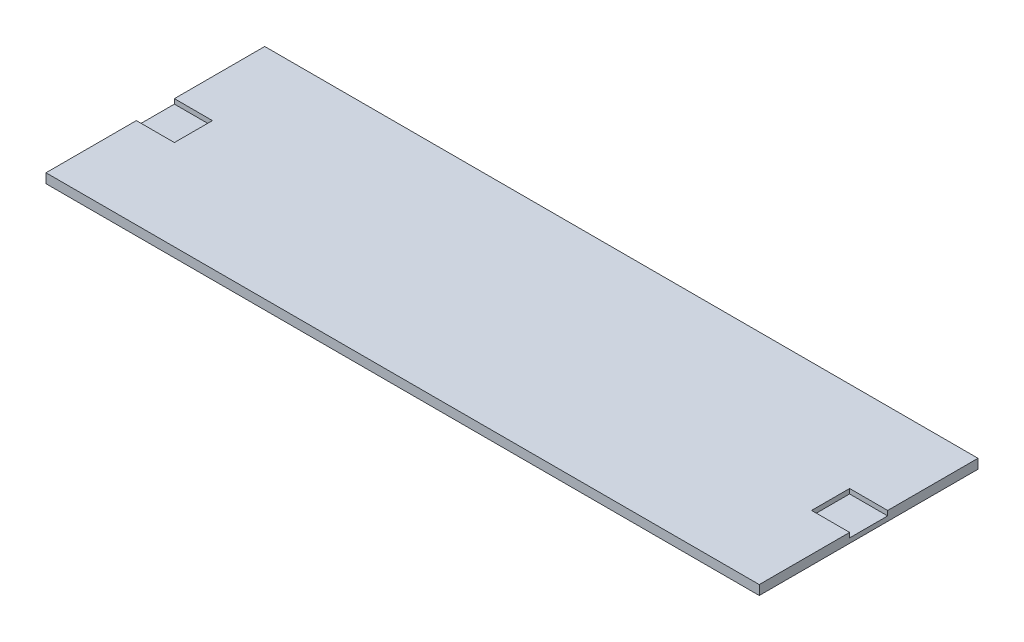
ISO-10303-21;
HEADER;
FILE_DESCRIPTION(('STEP AP214'),'2;1');
FILE_NAME('part.step','',(''),(''),'','','');
FILE_SCHEMA(('AUTOMOTIVE_DESIGN { 1 0 10303 214 1 1 1 1 }'));
ENDSEC;
DATA;
#1=APPLICATION_CONTEXT('core data for automotive mechanical design processes');
#2=APPLICATION_PROTOCOL_DEFINITION('international standard','automotive_design',2000,#1);
#3=PRODUCT_CONTEXT('',#1,'mechanical');
#4=PRODUCT('Part','Part','',(#3));
#5=PRODUCT_RELATED_PRODUCT_CATEGORY('part','',(#4));
#6=PRODUCT_DEFINITION_FORMATION('','',#4);
#7=PRODUCT_DEFINITION_CONTEXT('part definition',#1,'design');
#8=PRODUCT_DEFINITION('design','',#6,#7);
#9=PRODUCT_DEFINITION_SHAPE('','',#8);
#10=(LENGTH_UNIT() NAMED_UNIT(*) SI_UNIT(.MILLI.,.METRE.));
#11=(NAMED_UNIT(*) PLANE_ANGLE_UNIT() SI_UNIT($,.RADIAN.));
#12=(NAMED_UNIT(*) SI_UNIT($,.STERADIAN.) SOLID_ANGLE_UNIT());
#13=UNCERTAINTY_MEASURE_WITH_UNIT(LENGTH_MEASURE(1.E-05),#10,'distance_accuracy_value','');
#14=(GEOMETRIC_REPRESENTATION_CONTEXT(3) GLOBAL_UNCERTAINTY_ASSIGNED_CONTEXT((#13)) GLOBAL_UNIT_ASSIGNED_CONTEXT((#10,
#11,#12)) REPRESENTATION_CONTEXT('',''));
#15=CARTESIAN_POINT('',(0.,0.,0.));
#16=DIRECTION('',(0.,0.,1.));
#17=DIRECTION('',(1.,0.,0.));
#18=AXIS2_PLACEMENT_3D('',#15,#16,#17);
#19=CARTESIAN_POINT('',(-89.1210728294941,6.35,-55.7339246500866));
#20=DIRECTION('',(1.,0.,0.));
#21=DIRECTION('',(0.,0.,-1.));
#22=AXIS2_PLACEMENT_3D('',#19,#20,#21);
#23=PLANE('',#22);
#24=DIRECTION('',(0.,0.,1.));
#25=VECTOR('',#24,1.);
#26=CARTESIAN_POINT('',(-89.1210728294941,3.175,4.59107534991337));
#27=LINE('',#26,#25);
#28=CARTESIAN_POINT('',(-89.1210728294941,3.175,4.59107534991337));
#29=VERTEX_POINT('',#28);
#30=CARTESIAN_POINT('',(-89.1210728294941,3.175,29.9910753499134));
#31=VERTEX_POINT('',#30);
#32=EDGE_CURVE('E150',#29,#31,#27,.T.);
#33=ORIENTED_EDGE('',*,*,#32,.F.);
#34=DIRECTION('',(0.,1.,0.));
#35=VECTOR('',#34,1.);
#36=CARTESIAN_POINT('',(-89.1210728294941,3.175,4.59107534991337));
#37=LINE('',#36,#35);
#38=CARTESIAN_POINT('',(-89.1210728294941,6.35,4.59107534991337));
#39=VERTEX_POINT('',#38);
#40=EDGE_CURVE('E170',#29,#39,#37,.T.);
#41=ORIENTED_EDGE('',*,*,#40,.T.);
#42=DIRECTION('',(0.,0.,1.));
#43=VECTOR('',#42,1.);
#44=CARTESIAN_POINT('',(-89.1210728294941,6.35,-55.7339246500866));
#45=LINE('',#44,#43);
#46=CARTESIAN_POINT('',(-89.1210728294941,6.35,-55.7339246500866));
#47=VERTEX_POINT('',#46);
#48=EDGE_CURVE('E179',#47,#39,#45,.T.);
#49=ORIENTED_EDGE('',*,*,#48,.F.);
#50=DIRECTION('',(0.,-1.,0.));
#51=VECTOR('',#50,1.);
#52=CARTESIAN_POINT('',(-89.1210728294941,6.35,-55.7339246500866));
#53=LINE('',#52,#51);
#54=CARTESIAN_POINT('',(-89.1210728294941,0.,-55.7339246500866));
#55=VERTEX_POINT('',#54);
#56=EDGE_CURVE('E190',#47,#55,#53,.T.);
#57=ORIENTED_EDGE('',*,*,#56,.T.);
#58=DIRECTION('',(0.,0.,1.));
#59=VECTOR('',#58,1.);
#60=CARTESIAN_POINT('',(-89.1210728294941,0.,-55.7339246500866));
#61=LINE('',#60,#59);
#62=CARTESIAN_POINT('',(-89.1210728294941,0.,90.3160753499134));
#63=VERTEX_POINT('',#62);
#64=EDGE_CURVE('E173',#55,#63,#61,.T.);
#65=ORIENTED_EDGE('',*,*,#64,.T.);
#66=DIRECTION('',(0.,-1.,0.));
#67=VECTOR('',#66,1.);
#68=CARTESIAN_POINT('',(-89.1210728294941,6.35,90.3160753499134));
#69=LINE('',#68,#67);
#70=CARTESIAN_POINT('',(-89.1210728294941,6.35,90.3160753499134));
#71=VERTEX_POINT('',#70);
#72=EDGE_CURVE('E11',#71,#63,#69,.T.);
#73=ORIENTED_EDGE('',*,*,#72,.F.);
#74=CARTESIAN_POINT('',(-89.1210728294941,6.35,29.9910753499134));
#75=VERTEX_POINT('',#74);
#76=EDGE_CURVE('E183',#75,#71,#45,.T.);
#77=ORIENTED_EDGE('',*,*,#76,.F.);
#78=DIRECTION('',(0.,1.,0.));
#79=VECTOR('',#78,1.);
#80=CARTESIAN_POINT('',(-89.1210728294941,3.175,29.9910753499134));
#81=LINE('',#80,#79);
#82=EDGE_CURVE('E55',#31,#75,#81,.T.);
#83=ORIENTED_EDGE('',*,*,#82,.F.);
#84=EDGE_LOOP('',(#33,#41,#49,#57,#65,#73,#77,#83));
#85=FACE_BOUND('',#84,.T.);
#86=ADVANCED_FACE('F33',(#85),#23,.F.);
#87=CARTESIAN_POINT('',(-89.1210728294941,6.35,90.3160753499134));
#88=DIRECTION('',(0.,0.,-1.));
#89=DIRECTION('',(-1.,0.,0.));
#90=AXIS2_PLACEMENT_3D('',#87,#88,#89);
#91=PLANE('',#90);
#92=DIRECTION('',(1.,0.,0.));
#93=VECTOR('',#92,1.);
#94=CARTESIAN_POINT('',(-89.1210728294941,0.,90.3160753499134));
#95=LINE('',#94,#93);
#96=CARTESIAN_POINT('',(387.128927170506,0.,90.3160753499134));
#97=VERTEX_POINT('',#96);
#98=EDGE_CURVE('E193',#63,#97,#95,.T.);
#99=ORIENTED_EDGE('',*,*,#98,.T.);
#100=DIRECTION('',(0.,-1.,0.));
#101=VECTOR('',#100,1.);
#102=CARTESIAN_POINT('',(387.128927170506,6.35,90.3160753499134));
#103=LINE('',#102,#101);
#104=CARTESIAN_POINT('',(387.128927170506,6.35,90.3160753499134));
#105=VERTEX_POINT('',#104);
#106=EDGE_CURVE('E40',#105,#97,#103,.T.);
#107=ORIENTED_EDGE('',*,*,#106,.F.);
#108=DIRECTION('',(1.,0.,0.));
#109=VECTOR('',#108,1.);
#110=CARTESIAN_POINT('',(-89.1210728294941,6.35,90.3160753499134));
#111=LINE('',#110,#109);
#112=EDGE_CURVE('E182',#71,#105,#111,.T.);
#113=ORIENTED_EDGE('',*,*,#112,.F.);
#114=ORIENTED_EDGE('',*,*,#72,.T.);
#115=EDGE_LOOP('',(#99,#107,#113,#114));
#116=FACE_BOUND('',#115,.T.);
#117=ADVANCED_FACE('F240',(#116),#91,.F.);
#118=CARTESIAN_POINT('',(387.128927170506,6.35,-55.7339246500866));
#119=DIRECTION('',(-1.,0.,0.));
#120=DIRECTION('',(0.,0.,1.));
#121=AXIS2_PLACEMENT_3D('',#118,#119,#120);
#122=PLANE('',#121);
#123=DIRECTION('',(0.,0.,-1.));
#124=VECTOR('',#123,1.);
#125=CARTESIAN_POINT('',(387.128927170506,3.175,4.59107534991336));
#126=LINE('',#125,#124);
#127=CARTESIAN_POINT('',(387.128927170506,3.175,29.9910753499134));
#128=VERTEX_POINT('',#127);
#129=CARTESIAN_POINT('',(387.128927170506,3.175,4.59107534991336));
#130=VERTEX_POINT('',#129);
#131=EDGE_CURVE('E129',#128,#130,#126,.T.);
#132=ORIENTED_EDGE('',*,*,#131,.F.);
#133=DIRECTION('',(0.,1.,0.));
#134=VECTOR('',#133,1.);
#135=CARTESIAN_POINT('',(387.128927170506,3.175,29.9910753499134));
#136=LINE('',#135,#134);
#137=CARTESIAN_POINT('',(387.128927170506,6.35,29.9910753499134));
#138=VERTEX_POINT('',#137);
#139=EDGE_CURVE('E166',#128,#138,#136,.T.);
#140=ORIENTED_EDGE('',*,*,#139,.T.);
#141=DIRECTION('',(0.,0.,-1.));
#142=VECTOR('',#141,1.);
#143=CARTESIAN_POINT('',(387.128927170506,6.35,-55.7339246500866));
#144=LINE('',#143,#142);
#145=EDGE_CURVE('E185',#105,#138,#144,.T.);
#146=ORIENTED_EDGE('',*,*,#145,.F.);
#147=ORIENTED_EDGE('',*,*,#106,.T.);
#148=DIRECTION('',(0.,0.,-1.));
#149=VECTOR('',#148,1.);
#150=CARTESIAN_POINT('',(387.128927170506,0.,-55.7339246500866));
#151=LINE('',#150,#149);
#152=CARTESIAN_POINT('',(387.128927170506,0.,-55.7339246500866));
#153=VERTEX_POINT('',#152);
#154=EDGE_CURVE('E195',#97,#153,#151,.T.);
#155=ORIENTED_EDGE('',*,*,#154,.T.);
#156=DIRECTION('',(0.,-1.,0.));
#157=VECTOR('',#156,1.);
#158=CARTESIAN_POINT('',(387.128927170506,6.35,-55.7339246500866));
#159=LINE('',#158,#157);
#160=CARTESIAN_POINT('',(387.128927170506,6.35,-55.7339246500866));
#161=VERTEX_POINT('',#160);
#162=EDGE_CURVE('E201',#161,#153,#159,.T.);
#163=ORIENTED_EDGE('',*,*,#162,.F.);
#164=CARTESIAN_POINT('',(387.128927170506,6.35,4.59107534991336));
#165=VERTEX_POINT('',#164);
#166=EDGE_CURVE('E143',#165,#161,#144,.T.);
#167=ORIENTED_EDGE('',*,*,#166,.F.);
#168=DIRECTION('',(0.,1.,0.));
#169=VECTOR('',#168,1.);
#170=CARTESIAN_POINT('',(387.128927170506,3.175,4.59107534991336));
#171=LINE('',#170,#169);
#172=EDGE_CURVE('E47',#130,#165,#171,.T.);
#173=ORIENTED_EDGE('',*,*,#172,.F.);
#174=EDGE_LOOP('',(#132,#140,#146,#147,#155,#163,#167,#173));
#175=FACE_BOUND('',#174,.T.);
#176=ADVANCED_FACE('F141',(#175),#122,.F.);
#177=CARTESIAN_POINT('',(-89.1210728294941,6.35,-55.7339246500866));
#178=DIRECTION('',(0.,0.,1.));
#179=DIRECTION('',(1.,0.,0.));
#180=AXIS2_PLACEMENT_3D('',#177,#178,#179);
#181=PLANE('',#180);
#182=DIRECTION('',(-1.,0.,0.));
#183=VECTOR('',#182,1.);
#184=CARTESIAN_POINT('',(-89.1210728294941,0.,-55.7339246500866));
#185=LINE('',#184,#183);
#186=EDGE_CURVE('E197',#153,#55,#185,.T.);
#187=ORIENTED_EDGE('',*,*,#186,.T.);
#188=ORIENTED_EDGE('',*,*,#56,.F.);
#189=DIRECTION('',(-1.,0.,0.));
#190=VECTOR('',#189,1.);
#191=CARTESIAN_POINT('',(-89.1210728294941,6.35,-55.7339246500866));
#192=LINE('',#191,#190);
#193=EDGE_CURVE('E188',#161,#47,#192,.T.);
#194=ORIENTED_EDGE('',*,*,#193,.F.);
#195=ORIENTED_EDGE('',*,*,#162,.T.);
#196=EDGE_LOOP('',(#187,#188,#194,#195));
#197=FACE_BOUND('',#196,.T.);
#198=ADVANCED_FACE('F215',(#197),#181,.F.);
#199=CARTESIAN_POINT('',(-89.1210728294941,6.35,90.3160753499134));
#200=DIRECTION('',(0.,1.,0.));
#201=DIRECTION('',(0.,0.,1.));
#202=AXIS2_PLACEMENT_3D('',#199,#200,#201);
#203=PLANE('',#202);
#204=DIRECTION('',(1.,0.,0.));
#205=VECTOR('',#204,1.);
#206=CARTESIAN_POINT('',(387.128927170506,6.35,29.9910753499134));
#207=LINE('',#206,#205);
#208=CARTESIAN_POINT('',(361.728927170506,6.35,29.9910753499134));
#209=VERTEX_POINT('',#208);
#210=EDGE_CURVE('E138',#209,#138,#207,.T.);
#211=ORIENTED_EDGE('',*,*,#210,.F.);
#212=DIRECTION('',(0.,0.,1.));
#213=VECTOR('',#212,1.);
#214=CARTESIAN_POINT('',(361.728927170506,6.35,4.59107534991337));
#215=LINE('',#214,#213);
#216=CARTESIAN_POINT('',(361.728927170506,6.35,4.59107534991337));
#217=VERTEX_POINT('',#216);
#218=EDGE_CURVE('E229',#217,#209,#215,.T.);
#219=ORIENTED_EDGE('',*,*,#218,.F.);
#220=DIRECTION('',(-1.,0.,0.));
#221=VECTOR('',#220,1.);
#222=CARTESIAN_POINT('',(387.128927170506,6.35,4.59107534991336));
#223=LINE('',#222,#221);
#224=EDGE_CURVE('E227',#165,#217,#223,.T.);
#225=ORIENTED_EDGE('',*,*,#224,.F.);
#226=ORIENTED_EDGE('',*,*,#166,.T.);
#227=ORIENTED_EDGE('',*,*,#193,.T.);
#228=ORIENTED_EDGE('',*,*,#48,.T.);
#229=DIRECTION('',(-1.,0.,0.));
#230=VECTOR('',#229,1.);
#231=CARTESIAN_POINT('',(-89.1210728294941,6.35,4.59107534991337));
#232=LINE('',#231,#230);
#233=CARTESIAN_POINT('',(-63.7210728294941,6.35,4.59107534991337));
#234=VERTEX_POINT('',#233);
#235=EDGE_CURVE('E154',#234,#39,#232,.T.);
#236=ORIENTED_EDGE('',*,*,#235,.F.);
#237=DIRECTION('',(0.,0.,-1.));
#238=VECTOR('',#237,1.);
#239=CARTESIAN_POINT('',(-63.7210728294941,6.35,4.59107534991337));
#240=LINE('',#239,#238);
#241=CARTESIAN_POINT('',(-63.7210728294941,6.35,29.9910753499134));
#242=VERTEX_POINT('',#241);
#243=EDGE_CURVE('E165',#242,#234,#240,.T.);
#244=ORIENTED_EDGE('',*,*,#243,.F.);
#245=DIRECTION('',(1.,0.,0.));
#246=VECTOR('',#245,1.);
#247=CARTESIAN_POINT('',(-89.1210728294941,6.35,29.9910753499134));
#248=LINE('',#247,#246);
#249=EDGE_CURVE('E163',#75,#242,#248,.T.);
#250=ORIENTED_EDGE('',*,*,#249,.F.);
#251=ORIENTED_EDGE('',*,*,#76,.T.);
#252=ORIENTED_EDGE('',*,*,#112,.T.);
#253=ORIENTED_EDGE('',*,*,#145,.T.);
#254=EDGE_LOOP('',(#211,#219,#225,#226,#227,#228,#236,#244,#250,#251,#252,#253));
#255=FACE_BOUND('',#254,.T.);
#256=ADVANCED_FACE('F224',(#255),#203,.T.);
#257=CARTESIAN_POINT('',(-89.1210728294941,0.,90.3160753499134));
#258=DIRECTION('',(0.,1.,0.));
#259=DIRECTION('',(0.,0.,1.));
#260=AXIS2_PLACEMENT_3D('',#257,#258,#259);
#261=PLANE('',#260);
#262=ORIENTED_EDGE('',*,*,#64,.F.);
#263=ORIENTED_EDGE('',*,*,#186,.F.);
#264=ORIENTED_EDGE('',*,*,#154,.F.);
#265=ORIENTED_EDGE('',*,*,#98,.F.);
#266=EDGE_LOOP('',(#262,#263,#264,#265));
#267=FACE_BOUND('',#266,.T.);
#268=ADVANCED_FACE('F212',(#267),#261,.F.);
#269=CARTESIAN_POINT('',(-89.1210728294941,3.175,4.59107534991337));
#270=DIRECTION('',(0.,0.,-1.));
#271=DIRECTION('',(-1.,0.,0.));
#272=AXIS2_PLACEMENT_3D('',#269,#270,#271);
#273=PLANE('',#272);
#274=ORIENTED_EDGE('',*,*,#235,.T.);
#275=ORIENTED_EDGE('',*,*,#40,.F.);
#276=DIRECTION('',(-1.,0.,0.));
#277=VECTOR('',#276,1.);
#278=CARTESIAN_POINT('',(-89.1210728294941,3.175,4.59107534991337));
#279=LINE('',#278,#277);
#280=CARTESIAN_POINT('',(-63.7210728294941,3.175,4.59107534991337));
#281=VERTEX_POINT('',#280);
#282=EDGE_CURVE('E160',#281,#29,#279,.T.);
#283=ORIENTED_EDGE('',*,*,#282,.F.);
#284=DIRECTION('',(0.,1.,0.));
#285=VECTOR('',#284,1.);
#286=CARTESIAN_POINT('',(-63.7210728294941,3.175,4.59107534991337));
#287=LINE('',#286,#285);
#288=EDGE_CURVE('E174',#281,#234,#287,.T.);
#289=ORIENTED_EDGE('',*,*,#288,.T.);
#290=EDGE_LOOP('',(#274,#275,#283,#289));
#291=FACE_BOUND('',#290,.T.);
#292=ADVANCED_FACE('F246',(#291),#273,.F.);
#293=CARTESIAN_POINT('',(-63.7210728294941,3.175,4.59107534991337));
#294=DIRECTION('',(1.,0.,0.));
#295=DIRECTION('',(0.,0.,-1.));
#296=AXIS2_PLACEMENT_3D('',#293,#294,#295);
#297=PLANE('',#296);
#298=ORIENTED_EDGE('',*,*,#243,.T.);
#299=ORIENTED_EDGE('',*,*,#288,.F.);
#300=DIRECTION('',(0.,0.,-1.));
#301=VECTOR('',#300,1.);
#302=CARTESIAN_POINT('',(-63.7210728294941,3.175,4.59107534991337));
#303=LINE('',#302,#301);
#304=CARTESIAN_POINT('',(-63.7210728294941,3.175,29.9910753499134));
#305=VERTEX_POINT('',#304);
#306=EDGE_CURVE('E157',#305,#281,#303,.T.);
#307=ORIENTED_EDGE('',*,*,#306,.F.);
#308=DIRECTION('',(0.,1.,0.));
#309=VECTOR('',#308,1.);
#310=CARTESIAN_POINT('',(-63.7210728294941,3.175,29.9910753499134));
#311=LINE('',#310,#309);
#312=EDGE_CURVE('E176',#305,#242,#311,.T.);
#313=ORIENTED_EDGE('',*,*,#312,.T.);
#314=EDGE_LOOP('',(#298,#299,#307,#313));
#315=FACE_BOUND('',#314,.T.);
#316=ADVANCED_FACE('F248',(#315),#297,.F.);
#317=CARTESIAN_POINT('',(-89.1210728294941,3.175,29.9910753499134));
#318=DIRECTION('',(0.,0.,1.));
#319=DIRECTION('',(1.,0.,0.));
#320=AXIS2_PLACEMENT_3D('',#317,#318,#319);
#321=PLANE('',#320);
#322=ORIENTED_EDGE('',*,*,#249,.T.);
#323=ORIENTED_EDGE('',*,*,#312,.F.);
#324=DIRECTION('',(1.,0.,0.));
#325=VECTOR('',#324,1.);
#326=CARTESIAN_POINT('',(-89.1210728294941,3.175,29.9910753499134));
#327=LINE('',#326,#325);
#328=EDGE_CURVE('E153',#31,#305,#327,.T.);
#329=ORIENTED_EDGE('',*,*,#328,.F.);
#330=ORIENTED_EDGE('',*,*,#82,.T.);
#331=EDGE_LOOP('',(#322,#323,#329,#330));
#332=FACE_BOUND('',#331,.T.);
#333=ADVANCED_FACE('F249',(#332),#321,.F.);
#334=CARTESIAN_POINT('',(-89.1210728294941,3.175,29.9910753499134));
#335=DIRECTION('',(0.,1.,0.));
#336=DIRECTION('',(0.,0.,1.));
#337=AXIS2_PLACEMENT_3D('',#334,#335,#336);
#338=PLANE('',#337);
#339=ORIENTED_EDGE('',*,*,#32,.T.);
#340=ORIENTED_EDGE('',*,*,#328,.T.);
#341=ORIENTED_EDGE('',*,*,#306,.T.);
#342=ORIENTED_EDGE('',*,*,#282,.T.);
#343=EDGE_LOOP('',(#339,#340,#341,#342));
#344=FACE_BOUND('',#343,.T.);
#345=ADVANCED_FACE('F242',(#344),#338,.T.);
#346=CARTESIAN_POINT('',(387.128927170506,3.175,29.9910753499134));
#347=DIRECTION('',(0.,0.,1.));
#348=DIRECTION('',(1.,0.,0.));
#349=AXIS2_PLACEMENT_3D('',#346,#347,#348);
#350=PLANE('',#349);
#351=ORIENTED_EDGE('',*,*,#210,.T.);
#352=ORIENTED_EDGE('',*,*,#139,.F.);
#353=DIRECTION('',(1.,0.,0.));
#354=VECTOR('',#353,1.);
#355=CARTESIAN_POINT('',(387.128927170506,3.175,29.9910753499134));
#356=LINE('',#355,#354);
#357=CARTESIAN_POINT('',(361.728927170506,3.175,29.9910753499134));
#358=VERTEX_POINT('',#357);
#359=EDGE_CURVE('E135',#358,#128,#356,.T.);
#360=ORIENTED_EDGE('',*,*,#359,.F.);
#361=DIRECTION('',(0.,1.,0.));
#362=VECTOR('',#361,1.);
#363=CARTESIAN_POINT('',(361.728927170506,3.175,29.9910753499134));
#364=LINE('',#363,#362);
#365=EDGE_CURVE('E145',#358,#209,#364,.T.);
#366=ORIENTED_EDGE('',*,*,#365,.T.);
#367=EDGE_LOOP('',(#351,#352,#360,#366));
#368=FACE_BOUND('',#367,.T.);
#369=ADVANCED_FACE('F236',(#368),#350,.F.);
#370=CARTESIAN_POINT('',(361.728927170506,3.175,4.59107534991337));
#371=DIRECTION('',(-1.,0.,0.));
#372=DIRECTION('',(0.,0.,1.));
#373=AXIS2_PLACEMENT_3D('',#370,#371,#372);
#374=PLANE('',#373);
#375=ORIENTED_EDGE('',*,*,#218,.T.);
#376=ORIENTED_EDGE('',*,*,#365,.F.);
#377=DIRECTION('',(0.,0.,1.));
#378=VECTOR('',#377,1.);
#379=CARTESIAN_POINT('',(361.728927170506,3.175,4.59107534991337));
#380=LINE('',#379,#378);
#381=CARTESIAN_POINT('',(361.728927170506,3.175,4.59107534991337));
#382=VERTEX_POINT('',#381);
#383=EDGE_CURVE('E128',#382,#358,#380,.T.);
#384=ORIENTED_EDGE('',*,*,#383,.F.);
#385=DIRECTION('',(0.,1.,0.));
#386=VECTOR('',#385,1.);
#387=CARTESIAN_POINT('',(361.728927170506,3.175,4.59107534991337));
#388=LINE('',#387,#386);
#389=EDGE_CURVE('E124',#382,#217,#388,.T.);
#390=ORIENTED_EDGE('',*,*,#389,.T.);
#391=EDGE_LOOP('',(#375,#376,#384,#390));
#392=FACE_BOUND('',#391,.T.);
#393=ADVANCED_FACE('F238',(#392),#374,.F.);
#394=CARTESIAN_POINT('',(387.128927170506,3.175,4.59107534991336));
#395=DIRECTION('',(0.,0.,-1.));
#396=DIRECTION('',(-1.,0.,0.));
#397=AXIS2_PLACEMENT_3D('',#394,#395,#396);
#398=PLANE('',#397);
#399=ORIENTED_EDGE('',*,*,#224,.T.);
#400=ORIENTED_EDGE('',*,*,#389,.F.);
#401=DIRECTION('',(-1.,0.,0.));
#402=VECTOR('',#401,1.);
#403=CARTESIAN_POINT('',(387.128927170506,3.175,4.59107534991336));
#404=LINE('',#403,#402);
#405=EDGE_CURVE('E121',#130,#382,#404,.T.);
#406=ORIENTED_EDGE('',*,*,#405,.F.);
#407=ORIENTED_EDGE('',*,*,#172,.T.);
#408=EDGE_LOOP('',(#399,#400,#406,#407));
#409=FACE_BOUND('',#408,.T.);
#410=ADVANCED_FACE('F123',(#409),#398,.F.);
#411=CARTESIAN_POINT('',(387.128927170506,3.175,29.9910753499134));
#412=DIRECTION('',(0.,-1.,0.));
#413=DIRECTION('',(0.,0.,-1.));
#414=AXIS2_PLACEMENT_3D('',#411,#412,#413);
#415=PLANE('',#414);
#416=ORIENTED_EDGE('',*,*,#131,.T.);
#417=ORIENTED_EDGE('',*,*,#405,.T.);
#418=ORIENTED_EDGE('',*,*,#383,.T.);
#419=ORIENTED_EDGE('',*,*,#359,.T.);
#420=EDGE_LOOP('',(#416,#417,#418,#419));
#421=FACE_BOUND('',#420,.T.);
#422=ADVANCED_FACE('F133',(#421),#415,.F.);
#423=CLOSED_SHELL('',(#86,#117,#176,#198,#256,#268,#292,#316,#333,#345,#369,#393,#410,#422));
#424=MANIFOLD_SOLID_BREP('B2',#423);
#425=ADVANCED_BREP_SHAPE_REPRESENTATION('',(#18,#424),#14);
#426=SHAPE_DEFINITION_REPRESENTATION(#9,#425);
ENDSEC;
END-ISO-10303-21;
